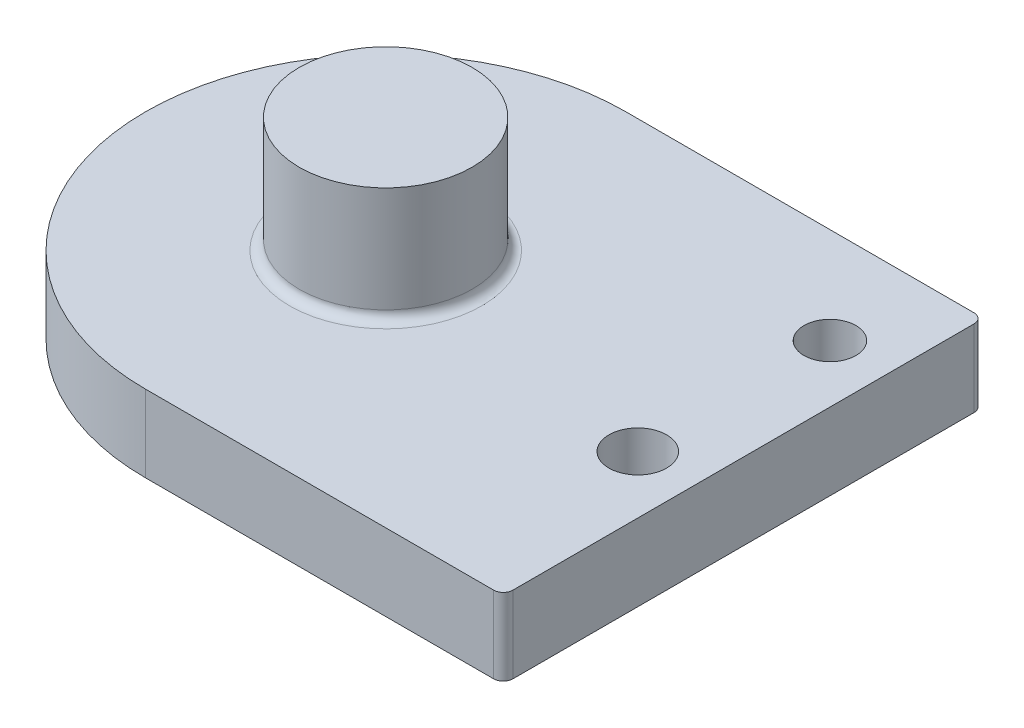
ISO-10303-21;
HEADER;
FILE_DESCRIPTION(('STEP AP214'),'2;1');
FILE_NAME('part.step','',(''),(''),'','','');
FILE_SCHEMA(('AUTOMOTIVE_DESIGN { 1 0 10303 214 1 1 1 1 }'));
ENDSEC;
DATA;
#1=APPLICATION_CONTEXT('core data for automotive mechanical design processes');
#2=APPLICATION_PROTOCOL_DEFINITION('international standard','automotive_design',2000,#1);
#3=PRODUCT_CONTEXT('',#1,'mechanical');
#4=PRODUCT('Part','Part','',(#3));
#5=PRODUCT_RELATED_PRODUCT_CATEGORY('part','',(#4));
#6=PRODUCT_DEFINITION_FORMATION('','',#4);
#7=PRODUCT_DEFINITION_CONTEXT('part definition',#1,'design');
#8=PRODUCT_DEFINITION('design','',#6,#7);
#9=PRODUCT_DEFINITION_SHAPE('','',#8);
#10=(LENGTH_UNIT() NAMED_UNIT(*) SI_UNIT(.MILLI.,.METRE.));
#11=(NAMED_UNIT(*) PLANE_ANGLE_UNIT() SI_UNIT($,.RADIAN.));
#12=(NAMED_UNIT(*) SI_UNIT($,.STERADIAN.) SOLID_ANGLE_UNIT());
#13=UNCERTAINTY_MEASURE_WITH_UNIT(LENGTH_MEASURE(1.E-05),#10,'distance_accuracy_value','');
#14=(GEOMETRIC_REPRESENTATION_CONTEXT(3) GLOBAL_UNCERTAINTY_ASSIGNED_CONTEXT((#13)) GLOBAL_UNIT_ASSIGNED_CONTEXT((#10,
#11,#12)) REPRESENTATION_CONTEXT('',''));
#15=CARTESIAN_POINT('',(0.,0.,0.));
#16=DIRECTION('',(0.,0.,1.));
#17=DIRECTION('',(1.,0.,0.));
#18=AXIS2_PLACEMENT_3D('',#15,#16,#17);
#19=CARTESIAN_POINT('',(14.3103355923049,2.,0.));
#20=DIRECTION('',(-1.,0.,0.));
#21=DIRECTION('',(0.,0.,1.));
#22=AXIS2_PLACEMENT_3D('',#19,#20,#21);
#23=PLANE('',#22);
#24=DIRECTION('',(0.,0.,-1.));
#25=VECTOR('',#24,1.);
#26=CARTESIAN_POINT('',(14.3103355923049,2.,0.));
#27=LINE('',#26,#25);
#28=CARTESIAN_POINT('',(14.3103355923049,2.,-0.25));
#29=VERTEX_POINT('',#28);
#30=CARTESIAN_POINT('',(14.3103355923049,2.,-12.25));
#31=VERTEX_POINT('',#30);
#32=EDGE_CURVE('E95',#29,#31,#27,.T.);
#33=ORIENTED_EDGE('',*,*,#32,.F.);
#34=DIRECTION('',(0.,-1.,0.));
#35=VECTOR('',#34,1.);
#36=CARTESIAN_POINT('',(14.3103355923049,2.,-0.25));
#37=LINE('',#36,#35);
#38=CARTESIAN_POINT('',(14.3103355923049,0.,-0.25));
#39=VERTEX_POINT('',#38);
#40=EDGE_CURVE('E138',#29,#39,#37,.T.);
#41=ORIENTED_EDGE('',*,*,#40,.T.);
#42=DIRECTION('',(0.,0.,-1.));
#43=VECTOR('',#42,1.);
#44=CARTESIAN_POINT('',(14.3103355923049,0.,0.));
#45=LINE('',#44,#43);
#46=CARTESIAN_POINT('',(14.3103355923049,0.,-12.25));
#47=VERTEX_POINT('',#46);
#48=EDGE_CURVE('E114',#39,#47,#45,.T.);
#49=ORIENTED_EDGE('',*,*,#48,.T.);
#50=DIRECTION('',(0.,-1.,0.));
#51=VECTOR('',#50,1.);
#52=CARTESIAN_POINT('',(14.3103355923049,2.,-12.25));
#53=LINE('',#52,#51);
#54=EDGE_CURVE('E136',#47,#31,#53,.F.);
#55=ORIENTED_EDGE('',*,*,#54,.T.);
#56=EDGE_LOOP('',(#33,#41,#49,#55));
#57=FACE_BOUND('',#56,.T.);
#58=ADVANCED_FACE('F34',(#57),#23,.F.);
#59=CARTESIAN_POINT('',(5.,2.,-12.5));
#60=DIRECTION('',(0.,0.,1.));
#61=DIRECTION('',(1.,0.,0.));
#62=AXIS2_PLACEMENT_3D('',#59,#60,#61);
#63=PLANE('',#62);
#64=DIRECTION('',(-1.,0.,0.));
#65=VECTOR('',#64,1.);
#66=CARTESIAN_POINT('',(5.,2.,-12.5));
#67=LINE('',#66,#65);
#68=CARTESIAN_POINT('',(14.0603355923049,2.,-12.5));
#69=VERTEX_POINT('',#68);
#70=CARTESIAN_POINT('',(5.,2.,-12.5));
#71=VERTEX_POINT('',#70);
#72=EDGE_CURVE('E87',#69,#71,#67,.T.);
#73=ORIENTED_EDGE('',*,*,#72,.F.);
#74=DIRECTION('',(0.,-1.,0.));
#75=VECTOR('',#74,1.);
#76=CARTESIAN_POINT('',(14.0603355923049,2.,-12.5));
#77=LINE('',#76,#75);
#78=CARTESIAN_POINT('',(14.0603355923049,0.,-12.5));
#79=VERTEX_POINT('',#78);
#80=EDGE_CURVE('E11',#69,#79,#77,.T.);
#81=ORIENTED_EDGE('',*,*,#80,.T.);
#82=DIRECTION('',(-1.,0.,0.));
#83=VECTOR('',#82,1.);
#84=CARTESIAN_POINT('',(5.,0.,-12.5));
#85=LINE('',#84,#83);
#86=CARTESIAN_POINT('',(5.,0.,-12.5));
#87=VERTEX_POINT('',#86);
#88=EDGE_CURVE('E101',#79,#87,#85,.T.);
#89=ORIENTED_EDGE('',*,*,#88,.T.);
#90=DIRECTION('',(0.,-1.,0.));
#91=VECTOR('',#90,1.);
#92=CARTESIAN_POINT('',(5.,2.,-12.5));
#93=LINE('',#92,#91);
#94=EDGE_CURVE('E98',#71,#87,#93,.T.);
#95=ORIENTED_EDGE('',*,*,#94,.F.);
#96=EDGE_LOOP('',(#73,#81,#89,#95));
#97=FACE_BOUND('',#96,.T.);
#98=ADVANCED_FACE('F99',(#97),#63,.F.);
#99=CARTESIAN_POINT('',(5.,2.,-6.25));
#100=DIRECTION('',(0.,-1.,0.));
#101=DIRECTION('',(0.,0.,-1.));
#102=AXIS2_PLACEMENT_3D('',#99,#100,#101);
#103=CYLINDRICAL_SURFACE('',#102,6.25);
#104=CARTESIAN_POINT('',(5.,0.,-6.25));
#105=DIRECTION('',(0.,1.,0.));
#106=DIRECTION('',(0.,0.,1.));
#107=AXIS2_PLACEMENT_3D('',#104,#105,#106);
#108=CIRCLE('',#107,6.25);
#109=CARTESIAN_POINT('',(5.,0.,0.));
#110=VERTEX_POINT('',#109);
#111=EDGE_CURVE('E119',#87,#110,#108,.T.);
#112=ORIENTED_EDGE('',*,*,#111,.T.);
#113=DIRECTION('',(0.,-1.,0.));
#114=VECTOR('',#113,1.);
#115=CARTESIAN_POINT('',(5.,2.,0.));
#116=LINE('',#115,#114);
#117=CARTESIAN_POINT('',(5.,2.,0.));
#118=VERTEX_POINT('',#117);
#119=EDGE_CURVE('E105',#118,#110,#116,.T.);
#120=ORIENTED_EDGE('',*,*,#119,.F.);
#121=CARTESIAN_POINT('',(5.,2.,-6.25));
#122=DIRECTION('',(0.,1.,0.));
#123=DIRECTION('',(0.,0.,1.));
#124=AXIS2_PLACEMENT_3D('',#121,#122,#123);
#125=CIRCLE('',#124,6.25);
#126=EDGE_CURVE('E91',#71,#118,#125,.T.);
#127=ORIENTED_EDGE('',*,*,#126,.F.);
#128=ORIENTED_EDGE('',*,*,#94,.T.);
#129=EDGE_LOOP('',(#112,#120,#127,#128));
#130=FACE_BOUND('',#129,.T.);
#131=ADVANCED_FACE('F107',(#130),#103,.T.);
#132=CARTESIAN_POINT('',(5.,2.,0.));
#133=DIRECTION('',(0.,0.,-1.));
#134=DIRECTION('',(-1.,0.,0.));
#135=AXIS2_PLACEMENT_3D('',#132,#133,#134);
#136=PLANE('',#135);
#137=DIRECTION('',(1.,0.,0.));
#138=VECTOR('',#137,1.);
#139=CARTESIAN_POINT('',(5.,0.,0.));
#140=LINE('',#139,#138);
#141=CARTESIAN_POINT('',(14.0603355923049,0.,0.));
#142=VERTEX_POINT('',#141);
#143=EDGE_CURVE('E121',#110,#142,#140,.T.);
#144=ORIENTED_EDGE('',*,*,#143,.T.);
#145=DIRECTION('',(0.,-1.,0.));
#146=VECTOR('',#145,1.);
#147=CARTESIAN_POINT('',(14.0603355923049,2.,0.));
#148=LINE('',#147,#146);
#149=CARTESIAN_POINT('',(14.0603355923049,2.,0.));
#150=VERTEX_POINT('',#149);
#151=EDGE_CURVE('E57',#142,#150,#148,.F.);
#152=ORIENTED_EDGE('',*,*,#151,.T.);
#153=DIRECTION('',(1.,0.,0.));
#154=VECTOR('',#153,1.);
#155=CARTESIAN_POINT('',(5.,2.,0.));
#156=LINE('',#155,#154);
#157=EDGE_CURVE('E109',#118,#150,#156,.T.);
#158=ORIENTED_EDGE('',*,*,#157,.F.);
#159=ORIENTED_EDGE('',*,*,#119,.T.);
#160=EDGE_LOOP('',(#144,#152,#158,#159));
#161=FACE_BOUND('',#160,.T.);
#162=ADVANCED_FACE('F157',(#161),#136,.F.);
#163=CARTESIAN_POINT('',(5.,2.,-6.25));
#164=DIRECTION('',(0.,1.,0.));
#165=DIRECTION('',(0.,0.,1.));
#166=AXIS2_PLACEMENT_3D('',#163,#164,#165);
#167=PLANE('',#166);
#168=CARTESIAN_POINT('',(5.,2.,-6.25));
#169=DIRECTION('',(0.,1.,0.));
#170=DIRECTION('',(0.,0.,1.));
#171=AXIS2_PLACEMENT_3D('',#168,#169,#170);
#172=CIRCLE('',#171,2.5);
#173=CARTESIAN_POINT('',(5.,2.,-3.75));
#174=VERTEX_POINT('',#173);
#175=EDGE_CURVE('E133',#174,#174,#172,.F.);
#176=ORIENTED_EDGE('',*,*,#175,.T.);
#177=EDGE_LOOP('',(#176));
#178=FACE_BOUND('',#177,.T.);
#179=CARTESIAN_POINT('',(12.8103355923049,2.,-10.));
#180=DIRECTION('',(0.,1.,0.));
#181=DIRECTION('',(0.,0.,1.));
#182=AXIS2_PLACEMENT_3D('',#179,#180,#181);
#183=CIRCLE('',#182,0.67663368147095);
#184=CARTESIAN_POINT('',(12.8103355923049,2.,-9.32336631852905));
#185=VERTEX_POINT('',#184);
#186=EDGE_CURVE('E128',#185,#185,#183,.T.);
#187=ORIENTED_EDGE('',*,*,#186,.F.);
#188=EDGE_LOOP('',(#187));
#189=FACE_BOUND('',#188,.T.);
#190=CARTESIAN_POINT('',(12.8103355923049,2.,-5.));
#191=DIRECTION('',(0.,1.,0.));
#192=DIRECTION('',(0.,0.,1.));
#193=AXIS2_PLACEMENT_3D('',#190,#191,#192);
#194=CIRCLE('',#193,0.75065767176907);
#195=CARTESIAN_POINT('',(12.8103355923049,2.,-4.24934232823093));
#196=VERTEX_POINT('',#195);
#197=EDGE_CURVE('E278',#196,#196,#194,.T.);
#198=ORIENTED_EDGE('',*,*,#197,.F.);
#199=EDGE_LOOP('',(#198));
#200=FACE_BOUND('',#199,.T.);
#201=ORIENTED_EDGE('',*,*,#157,.T.);
#202=CARTESIAN_POINT('',(14.0603355923049,2.,-0.25));
#203=DIRECTION('',(0.,1.,0.));
#204=DIRECTION('',(0.,0.,1.));
#205=AXIS2_PLACEMENT_3D('',#202,#203,#204);
#206=CIRCLE('',#205,0.25);
#207=EDGE_CURVE('E42',#150,#29,#206,.T.);
#208=ORIENTED_EDGE('',*,*,#207,.T.);
#209=ORIENTED_EDGE('',*,*,#32,.T.);
#210=CARTESIAN_POINT('',(14.0603355923049,2.,-12.25));
#211=DIRECTION('',(0.,1.,0.));
#212=DIRECTION('',(0.,0.,1.));
#213=AXIS2_PLACEMENT_3D('',#210,#211,#212);
#214=CIRCLE('',#213,0.25);
#215=EDGE_CURVE('E49',#31,#69,#214,.T.);
#216=ORIENTED_EDGE('',*,*,#215,.T.);
#217=ORIENTED_EDGE('',*,*,#72,.T.);
#218=ORIENTED_EDGE('',*,*,#126,.T.);
#219=EDGE_LOOP('',(#201,#208,#209,#216,#217,#218));
#220=FACE_BOUND('',#219,.T.);
#221=ADVANCED_FACE('F89',(#178,#189,#200,#220),#167,.T.);
#222=CARTESIAN_POINT('',(5.,0.,-6.25));
#223=DIRECTION('',(0.,1.,0.));
#224=DIRECTION('',(0.,0.,1.));
#225=AXIS2_PLACEMENT_3D('',#222,#223,#224);
#226=PLANE('',#225);
#227=CARTESIAN_POINT('',(12.8103355923049,0.,-10.));
#228=DIRECTION('',(0.,1.,0.));
#229=DIRECTION('',(0.,0.,1.));
#230=AXIS2_PLACEMENT_3D('',#227,#228,#229);
#231=CIRCLE('',#230,0.67663368147095);
#232=CARTESIAN_POINT('',(12.8103355923049,0.,-9.32336631852905));
#233=VERTEX_POINT('',#232);
#234=EDGE_CURVE('E127',#233,#233,#231,.T.);
#235=ORIENTED_EDGE('',*,*,#234,.T.);
#236=EDGE_LOOP('',(#235));
#237=FACE_BOUND('',#236,.T.);
#238=CARTESIAN_POINT('',(12.8103355923049,0.,-5.));
#239=DIRECTION('',(0.,1.,0.));
#240=DIRECTION('',(0.,0.,1.));
#241=AXIS2_PLACEMENT_3D('',#238,#239,#240);
#242=CIRCLE('',#241,0.75065767176907);
#243=CARTESIAN_POINT('',(12.8103355923049,0.,-4.24934232823093));
#244=VERTEX_POINT('',#243);
#245=EDGE_CURVE('E124',#244,#244,#242,.T.);
#246=ORIENTED_EDGE('',*,*,#245,.T.);
#247=EDGE_LOOP('',(#246));
#248=FACE_BOUND('',#247,.T.);
#249=ORIENTED_EDGE('',*,*,#48,.F.);
#250=CARTESIAN_POINT('',(14.0603355923049,0.,-0.25));
#251=DIRECTION('',(0.,1.,0.));
#252=DIRECTION('',(0.,0.,1.));
#253=AXIS2_PLACEMENT_3D('',#250,#251,#252);
#254=CIRCLE('',#253,0.25);
#255=EDGE_CURVE('E143',#39,#142,#254,.F.);
#256=ORIENTED_EDGE('',*,*,#255,.T.);
#257=ORIENTED_EDGE('',*,*,#143,.F.);
#258=ORIENTED_EDGE('',*,*,#111,.F.);
#259=ORIENTED_EDGE('',*,*,#88,.F.);
#260=CARTESIAN_POINT('',(14.0603355923049,0.,-12.25));
#261=DIRECTION('',(0.,1.,0.));
#262=DIRECTION('',(0.,0.,1.));
#263=AXIS2_PLACEMENT_3D('',#260,#261,#262);
#264=CIRCLE('',#263,0.25);
#265=EDGE_CURVE('E141',#79,#47,#264,.F.);
#266=ORIENTED_EDGE('',*,*,#265,.T.);
#267=EDGE_LOOP('',(#249,#256,#257,#258,#259,#266));
#268=FACE_BOUND('',#267,.T.);
#269=ADVANCED_FACE('F156',(#237,#248,#268),#226,.F.);
#270=CARTESIAN_POINT('',(5.,5.,-6.25));
#271=DIRECTION('',(0.,-1.,0.));
#272=DIRECTION('',(0.,0.,-1.));
#273=AXIS2_PLACEMENT_3D('',#270,#271,#272);
#274=CYLINDRICAL_SURFACE('',#273,2.25);
#275=CARTESIAN_POINT('',(5.,2.25,-6.25));
#276=DIRECTION('',(0.,1.,0.));
#277=DIRECTION('',(0.,0.,1.));
#278=AXIS2_PLACEMENT_3D('',#275,#276,#277);
#279=CIRCLE('',#278,2.25);
#280=CARTESIAN_POINT('',(5.,2.25,-4.));
#281=VERTEX_POINT('',#280);
#282=EDGE_CURVE('E104',#281,#281,#279,.T.);
#283=ORIENTED_EDGE('',*,*,#282,.T.);
#284=EDGE_LOOP('',(#283));
#285=FACE_BOUND('',#284,.T.);
#286=CARTESIAN_POINT('',(5.,5.,-6.25));
#287=DIRECTION('',(0.,1.,0.));
#288=DIRECTION('',(0.,0.,1.));
#289=AXIS2_PLACEMENT_3D('',#286,#287,#288);
#290=CIRCLE('',#289,2.25);
#291=CARTESIAN_POINT('',(5.,5.,-4.));
#292=VERTEX_POINT('',#291);
#293=EDGE_CURVE('E117',#292,#292,#290,.T.);
#294=ORIENTED_EDGE('',*,*,#293,.F.);
#295=EDGE_LOOP('',(#294));
#296=FACE_BOUND('',#295,.T.);
#297=ADVANCED_FACE('F200',(#285,#296),#274,.T.);
#298=CARTESIAN_POINT('',(5.,5.,-6.25));
#299=DIRECTION('',(0.,1.,0.));
#300=DIRECTION('',(0.,0.,1.));
#301=AXIS2_PLACEMENT_3D('',#298,#299,#300);
#302=PLANE('',#301);
#303=ORIENTED_EDGE('',*,*,#293,.T.);
#304=EDGE_LOOP('',(#303));
#305=FACE_BOUND('',#304,.T.);
#306=ADVANCED_FACE('F237',(#305),#302,.T.);
#307=CARTESIAN_POINT('',(12.8103355923049,-8.,-5.));
#308=DIRECTION('',(0.,1.,0.));
#309=DIRECTION('',(0.,0.,1.));
#310=AXIS2_PLACEMENT_3D('',#307,#308,#309);
#311=CYLINDRICAL_SURFACE('',#310,0.75065767176907);
#312=ORIENTED_EDGE('',*,*,#197,.T.);
#313=EDGE_LOOP('',(#312));
#314=FACE_BOUND('',#313,.T.);
#315=ORIENTED_EDGE('',*,*,#245,.F.);
#316=EDGE_LOOP('',(#315));
#317=FACE_BOUND('',#316,.T.);
#318=ADVANCED_FACE('F247',(#314,#317),#311,.F.);
#319=CARTESIAN_POINT('',(12.8103355923049,-8.,-10.));
#320=DIRECTION('',(0.,1.,0.));
#321=DIRECTION('',(0.,0.,1.));
#322=AXIS2_PLACEMENT_3D('',#319,#320,#321);
#323=CYLINDRICAL_SURFACE('',#322,0.67663368147095);
#324=ORIENTED_EDGE('',*,*,#186,.T.);
#325=EDGE_LOOP('',(#324));
#326=FACE_BOUND('',#325,.T.);
#327=ORIENTED_EDGE('',*,*,#234,.F.);
#328=EDGE_LOOP('',(#327));
#329=FACE_BOUND('',#328,.T.);
#330=ADVANCED_FACE('F177',(#326,#329),#323,.F.);
#331=CARTESIAN_POINT('',(5.,2.25,-6.25));
#332=DIRECTION('',(0.,1.,0.));
#333=DIRECTION('',(0.,0.,1.));
#334=AXIS2_PLACEMENT_3D('',#331,#332,#333);
#335=TOROIDAL_SURFACE('',#334,2.5,0.25);
#336=ORIENTED_EDGE('',*,*,#175,.F.);
#337=EDGE_LOOP('',(#336));
#338=FACE_BOUND('',#337,.T.);
#339=ORIENTED_EDGE('',*,*,#282,.F.);
#340=EDGE_LOOP('',(#339));
#341=FACE_BOUND('',#340,.T.);
#342=ADVANCED_FACE('F175',(#338,#341),#335,.F.);
#343=CARTESIAN_POINT('',(14.0603355923049,2.,-0.25));
#344=DIRECTION('',(0.,-1.,0.));
#345=DIRECTION('',(0.,0.,-1.));
#346=AXIS2_PLACEMENT_3D('',#343,#344,#345);
#347=CYLINDRICAL_SURFACE('',#346,0.25);
#348=ORIENTED_EDGE('',*,*,#207,.F.);
#349=ORIENTED_EDGE('',*,*,#151,.F.);
#350=ORIENTED_EDGE('',*,*,#255,.F.);
#351=ORIENTED_EDGE('',*,*,#40,.F.);
#352=EDGE_LOOP('',(#348,#349,#350,#351));
#353=FACE_BOUND('',#352,.T.);
#354=ADVANCED_FACE('F153',(#353),#347,.T.);
#355=CARTESIAN_POINT('',(14.0603355923049,2.,-12.25));
#356=DIRECTION('',(0.,-1.,0.));
#357=DIRECTION('',(0.,0.,-1.));
#358=AXIS2_PLACEMENT_3D('',#355,#356,#357);
#359=CYLINDRICAL_SURFACE('',#358,0.25);
#360=ORIENTED_EDGE('',*,*,#215,.F.);
#361=ORIENTED_EDGE('',*,*,#54,.F.);
#362=ORIENTED_EDGE('',*,*,#265,.F.);
#363=ORIENTED_EDGE('',*,*,#80,.F.);
#364=EDGE_LOOP('',(#360,#361,#362,#363));
#365=FACE_BOUND('',#364,.T.);
#366=ADVANCED_FACE('F36',(#365),#359,.T.);
#367=CLOSED_SHELL('',(#58,#98,#131,#162,#221,#269,#297,#306,#318,#330,#342,#354,#366));
#368=MANIFOLD_SOLID_BREP('B2',#367);
#369=ADVANCED_BREP_SHAPE_REPRESENTATION('',(#18,#368),#14);
#370=SHAPE_DEFINITION_REPRESENTATION(#9,#369);
ENDSEC;
END-ISO-10303-21;
